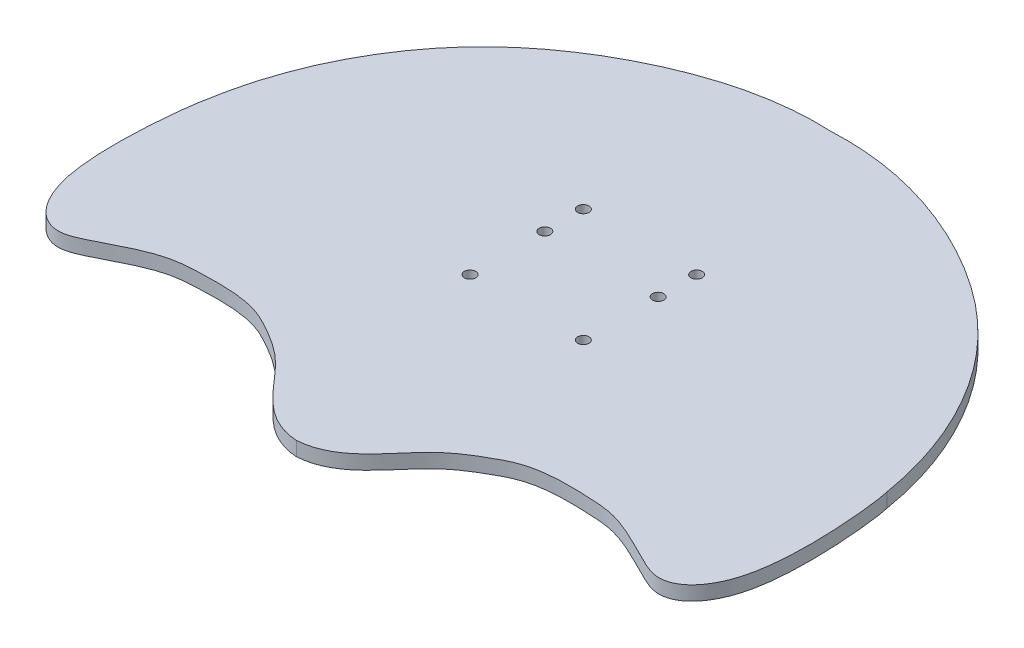
ISO-10303-21;
HEADER;
FILE_DESCRIPTION(('STEP AP214'),'2;1');
FILE_NAME('part.step','',(''),(''),'','','');
FILE_SCHEMA(('AUTOMOTIVE_DESIGN { 1 0 10303 214 1 1 1 1 }'));
ENDSEC;
DATA;
#1=APPLICATION_CONTEXT('core data for automotive mechanical design processes');
#2=APPLICATION_PROTOCOL_DEFINITION('international standard','automotive_design',2000,#1);
#3=PRODUCT_CONTEXT('',#1,'mechanical');
#4=PRODUCT('Part','Part','',(#3));
#5=PRODUCT_RELATED_PRODUCT_CATEGORY('part','',(#4));
#6=PRODUCT_DEFINITION_FORMATION('','',#4);
#7=PRODUCT_DEFINITION_CONTEXT('part definition',#1,'design');
#8=PRODUCT_DEFINITION('design','',#6,#7);
#9=PRODUCT_DEFINITION_SHAPE('','',#8);
#10=(LENGTH_UNIT() NAMED_UNIT(*) SI_UNIT(.MILLI.,.METRE.));
#11=(NAMED_UNIT(*) PLANE_ANGLE_UNIT() SI_UNIT($,.RADIAN.));
#12=(NAMED_UNIT(*) SI_UNIT($,.STERADIAN.) SOLID_ANGLE_UNIT());
#13=UNCERTAINTY_MEASURE_WITH_UNIT(LENGTH_MEASURE(1.E-05),#10,'distance_accuracy_value','');
#14=(GEOMETRIC_REPRESENTATION_CONTEXT(3) GLOBAL_UNCERTAINTY_ASSIGNED_CONTEXT((#13)) GLOBAL_UNIT_ASSIGNED_CONTEXT((#10,
#11,#12)) REPRESENTATION_CONTEXT('',''));
#15=CARTESIAN_POINT('',(0.,0.,0.));
#16=DIRECTION('',(0.,0.,1.));
#17=DIRECTION('',(1.,0.,0.));
#18=AXIS2_PLACEMENT_3D('',#15,#16,#17);
#19=CARTESIAN_POINT('',(-190.5,7.9502,0.));
#20=CARTESIAN_POINT('',(-192.064011792662,7.9502,4.96350192621509));
#21=CARTESIAN_POINT('',(-201.967167765924,7.9502,83.3146183109833));
#22=CARTESIAN_POINT('',(-174.696602041029,7.9502,109.289958804391));
#23=CARTESIAN_POINT('',(-151.630121659032,7.9502,100.567984898405));
#24=CARTESIAN_POINT('',(-131.410771519055,7.9502,87.7197839609674));
#25=CARTESIAN_POINT('',(-96.8435676275136,7.9502,85.3754033772216));
#26=CARTESIAN_POINT('',(-78.6925101438482,7.9502,86.2588274201763));
#27=CARTESIAN_POINT('',(-58.8335330715194,7.9502,96.8793824699203));
#28=CARTESIAN_POINT('',(-37.3059346099107,7.9502,109.935798161985));
#29=CARTESIAN_POINT('',(-21.3496139460233,7.9502,139.114767456721));
#30=CARTESIAN_POINT('',(1.40754784340045E-13,7.9502,140.530090072389));
#31=B_SPLINE_CURVE_WITH_KNOTS('',3,(#19,#20,#21,#22,#23,#24,#25,#26,#27,#28,#29,#30),
.UNSPECIFIED.,.F.,.F.,(4,1,1,1,1,1,1,1,1,4),(0.,0.166997051795611,0.292320514089622,
0.319633117373991,0.426735310498713,0.458914050276757,0.609241775376387,0.641909703937047,
0.766802370245909,1.),.UNSPECIFIED.);
#32=DIRECTION('',(0.,-1.,0.));
#33=VECTOR('',#32,1.);
#34=SURFACE_OF_LINEAR_EXTRUSION('',#31,#33);
#35=CARTESIAN_POINT('',(-190.5,0.,0.));
#36=CARTESIAN_POINT('',(-192.064011792662,0.,4.96350192621509));
#37=CARTESIAN_POINT('',(-201.967167765924,0.,83.3146183109833));
#38=CARTESIAN_POINT('',(-174.696602041029,0.,109.289958804391));
#39=CARTESIAN_POINT('',(-151.630121659032,0.,100.567984898405));
#40=CARTESIAN_POINT('',(-131.410771519055,0.,87.7197839609674));
#41=CARTESIAN_POINT('',(-96.8435676275136,0.,85.3754033772216));
#42=CARTESIAN_POINT('',(-78.6925101438482,0.,86.2588274201763));
#43=CARTESIAN_POINT('',(-58.8335330715194,0.,96.8793824699203));
#44=CARTESIAN_POINT('',(-37.3059346099107,0.,109.935798161985));
#45=CARTESIAN_POINT('',(-21.3496139460233,0.,139.114767456721));
#46=CARTESIAN_POINT('',(1.40754784340045E-13,0.,140.530090072389));
#47=B_SPLINE_CURVE_WITH_KNOTS('',3,(#35,#36,#37,#38,#39,#40,#41,#42,#43,#44,#45,#46),
.UNSPECIFIED.,.F.,.F.,(4,1,1,1,1,1,1,1,1,4),(0.,0.166997051795611,0.292320514089622,
0.319633117373991,0.426735310498713,0.458914050276757,0.609241775376387,0.641909703937047,
0.766802370245909,1.),.UNSPECIFIED.);
#48=CARTESIAN_POINT('',(-190.5,0.,0.));
#49=VERTEX_POINT('',#48);
#50=CARTESIAN_POINT('',(-1.06334839341837E-13,0.,140.530090072389));
#51=VERTEX_POINT('',#50);
#52=EDGE_CURVE('E141',#49,#51,#47,.T.);
#53=ORIENTED_EDGE('',*,*,#52,.T.);
#54=DIRECTION('',(0.,-1.,0.));
#55=VECTOR('',#54,1.);
#56=CARTESIAN_POINT('',(-1.06334839341837E-13,7.9502,140.530090072389));
#57=LINE('',#56,#55);
#58=CARTESIAN_POINT('',(-1.06334839341837E-13,7.9502,140.530090072389));
#59=VERTEX_POINT('',#58);
#60=EDGE_CURVE('E11',#59,#51,#57,.T.);
#61=ORIENTED_EDGE('',*,*,#60,.F.);
#62=CARTESIAN_POINT('',(-190.5,7.9502,0.));
#63=VERTEX_POINT('',#62);
#64=EDGE_CURVE('E99',#63,#59,#31,.T.);
#65=ORIENTED_EDGE('',*,*,#64,.F.);
#66=DIRECTION('',(0.,-1.,0.));
#67=VECTOR('',#66,1.);
#68=CARTESIAN_POINT('',(-190.5,7.9502,0.));
#69=LINE('',#68,#67);
#70=EDGE_CURVE('E112',#63,#49,#69,.T.);
#71=ORIENTED_EDGE('',*,*,#70,.T.);
#72=EDGE_LOOP('',(#53,#61,#65,#71));
#73=FACE_BOUND('',#72,.T.);
#74=ADVANCED_FACE('F46',(#73),#34,.F.);
#75=CARTESIAN_POINT('',(-1.06334839341837E-13,7.9502,140.530090072389));
#76=CARTESIAN_POINT('',(21.3496139460233,7.9502,139.114767456721));
#77=CARTESIAN_POINT('',(37.3059346099107,7.9502,109.935798161984));
#78=CARTESIAN_POINT('',(58.8335330715195,7.9502,96.8793824699203));
#79=CARTESIAN_POINT('',(78.6925101438482,7.9502,86.2588274201763));
#80=CARTESIAN_POINT('',(96.8435676275136,7.9502,85.3754033772216));
#81=CARTESIAN_POINT('',(131.410771519055,7.9502,87.7197839609674));
#82=CARTESIAN_POINT('',(151.630121659032,7.9502,100.567984898405));
#83=CARTESIAN_POINT('',(174.696602041029,7.9502,109.289958804391));
#84=CARTESIAN_POINT('',(201.967167765924,7.9502,83.3146183109832));
#85=CARTESIAN_POINT('',(192.064011792662,7.9502,4.96350192621503));
#86=CARTESIAN_POINT('',(190.5,7.9502,0.));
#87=B_SPLINE_CURVE_WITH_KNOTS('',3,(#75,#76,#77,#78,#79,#80,#81,#82,#83,#84,#85,#86),
.UNSPECIFIED.,.F.,.F.,(4,1,1,1,1,1,1,1,1,4),(0.,0.233197629754091,0.358090296062953,
0.390758224623613,0.541085949723243,0.573264689501287,0.680366882626009,0.707679485910378,
0.833002948204389,1.),.UNSPECIFIED.);
#88=DIRECTION('',(0.,-1.,0.));
#89=VECTOR('',#88,1.);
#90=SURFACE_OF_LINEAR_EXTRUSION('',#87,#89);
#91=CARTESIAN_POINT('',(-1.06334839341837E-13,0.,140.530090072389));
#92=CARTESIAN_POINT('',(21.3496139460233,0.,139.114767456721));
#93=CARTESIAN_POINT('',(37.3059346099107,0.,109.935798161984));
#94=CARTESIAN_POINT('',(58.8335330715195,0.,96.8793824699203));
#95=CARTESIAN_POINT('',(78.6925101438482,0.,86.2588274201763));
#96=CARTESIAN_POINT('',(96.8435676275136,0.,85.3754033772216));
#97=CARTESIAN_POINT('',(131.410771519055,0.,87.7197839609674));
#98=CARTESIAN_POINT('',(151.630121659032,0.,100.567984898405));
#99=CARTESIAN_POINT('',(174.696602041029,0.,109.289958804391));
#100=CARTESIAN_POINT('',(201.967167765924,0.,83.3146183109832));
#101=CARTESIAN_POINT('',(192.064011792662,0.,4.96350192621503));
#102=CARTESIAN_POINT('',(190.5,0.,0.));
#103=B_SPLINE_CURVE_WITH_KNOTS('',3,(#91,#92,#93,#94,#95,#96,#97,#98,#99,#100,#101,#102),
.UNSPECIFIED.,.F.,.F.,(4,1,1,1,1,1,1,1,1,4),(0.,0.233197629754091,0.358090296062953,
0.390758224623613,0.541085949723243,0.573264689501287,0.680366882626009,0.707679485910378,
0.833002948204389,1.),.UNSPECIFIED.);
#104=CARTESIAN_POINT('',(190.5,0.,0.));
#105=VERTEX_POINT('',#104);
#106=EDGE_CURVE('E104',#51,#105,#103,.T.);
#107=ORIENTED_EDGE('',*,*,#106,.T.);
#108=DIRECTION('',(0.,-1.,0.));
#109=VECTOR('',#108,1.);
#110=CARTESIAN_POINT('',(190.5,7.9502,0.));
#111=LINE('',#110,#109);
#112=CARTESIAN_POINT('',(190.5,7.9502,0.));
#113=VERTEX_POINT('',#112);
#114=EDGE_CURVE('E56',#113,#105,#111,.T.);
#115=ORIENTED_EDGE('',*,*,#114,.F.);
#116=EDGE_CURVE('E94',#59,#113,#87,.T.);
#117=ORIENTED_EDGE('',*,*,#116,.F.);
#118=ORIENTED_EDGE('',*,*,#60,.T.);
#119=EDGE_LOOP('',(#107,#115,#117,#118));
#120=FACE_BOUND('',#119,.T.);
#121=ADVANCED_FACE('F103',(#120),#90,.F.);
#122=CARTESIAN_POINT('',(190.5,7.9502,0.));
#123=CARTESIAN_POINT('',(184.392726562295,7.9502,-37.5370382365467));
#124=CARTESIAN_POINT('',(157.261289846749,7.9502,-93.9640934852783));
#125=CARTESIAN_POINT('',(82.3874782016624,7.9502,-146.622658841393));
#126=CARTESIAN_POINT('',(31.3113741429568,7.9502,-160.799884185231));
#127=CARTESIAN_POINT('',(0.,7.9502,-159.189909927611));
#128=B_SPLINE_CURVE_WITH_KNOTS('',3,(#122,#123,#124,#125,#126,#127),.UNSPECIFIED.,.F.,.F.,(4,1,
1,4),(0.,0.424401365551712,0.65636958095173,1.),.UNSPECIFIED.);
#129=DIRECTION('',(0.,-1.,0.));
#130=VECTOR('',#129,1.);
#131=SURFACE_OF_LINEAR_EXTRUSION('',#128,#130);
#132=CARTESIAN_POINT('',(190.5,0.,0.));
#133=CARTESIAN_POINT('',(184.392726562295,0.,-37.5370382365467));
#134=CARTESIAN_POINT('',(157.261289846749,0.,-93.9640934852783));
#135=CARTESIAN_POINT('',(82.3874782016624,0.,-146.622658841393));
#136=CARTESIAN_POINT('',(31.3113741429568,0.,-160.799884185231));
#137=CARTESIAN_POINT('',(0.,0.,-159.189909927611));
#138=B_SPLINE_CURVE_WITH_KNOTS('',3,(#132,#133,#134,#135,#136,#137),.UNSPECIFIED.,.F.,.F.,(4,1,
1,4),(0.,0.424401365551712,0.65636958095173,1.),.UNSPECIFIED.);
#139=CARTESIAN_POINT('',(0.,0.,-159.189909927611));
#140=VERTEX_POINT('',#139);
#141=EDGE_CURVE('E81',#105,#140,#138,.T.);
#142=ORIENTED_EDGE('',*,*,#141,.T.);
#143=DIRECTION('',(0.,-1.,0.));
#144=VECTOR('',#143,1.);
#145=CARTESIAN_POINT('',(0.,7.9502,-159.189909927611));
#146=LINE('',#145,#144);
#147=CARTESIAN_POINT('',(0.,7.9502,-159.189909927611));
#148=VERTEX_POINT('',#147);
#149=EDGE_CURVE('E106',#148,#140,#146,.T.);
#150=ORIENTED_EDGE('',*,*,#149,.F.);
#151=EDGE_CURVE('E97',#113,#148,#128,.T.);
#152=ORIENTED_EDGE('',*,*,#151,.F.);
#153=ORIENTED_EDGE('',*,*,#114,.T.);
#154=EDGE_LOOP('',(#142,#150,#152,#153));
#155=FACE_BOUND('',#154,.T.);
#156=ADVANCED_FACE('F107',(#155),#131,.F.);
#157=CARTESIAN_POINT('',(0.,7.9502,-159.189909927611));
#158=CARTESIAN_POINT('',(-31.3113741429568,7.9502,-160.799884185231));
#159=CARTESIAN_POINT('',(-82.3874782016624,7.9502,-146.622658841393));
#160=CARTESIAN_POINT('',(-157.261289846749,7.9502,-93.9640934852783));
#161=CARTESIAN_POINT('',(-184.392726562295,7.9502,-37.5370382365467));
#162=CARTESIAN_POINT('',(-190.5,7.9502,0.));
#163=B_SPLINE_CURVE_WITH_KNOTS('',3,(#157,#158,#159,#160,#161,#162),.UNSPECIFIED.,.F.,.F.,(4,1,
1,4),(0.,0.34363041904827,0.575598634448288,1.),.UNSPECIFIED.);
#164=DIRECTION('',(0.,-1.,0.));
#165=VECTOR('',#164,1.);
#166=SURFACE_OF_LINEAR_EXTRUSION('',#163,#165);
#167=CARTESIAN_POINT('',(0.,0.,-159.189909927611));
#168=CARTESIAN_POINT('',(-31.3113741429568,0.,-160.799884185231));
#169=CARTESIAN_POINT('',(-82.3874782016624,0.,-146.622658841393));
#170=CARTESIAN_POINT('',(-157.261289846749,0.,-93.9640934852783));
#171=CARTESIAN_POINT('',(-184.392726562295,0.,-37.5370382365467));
#172=CARTESIAN_POINT('',(-190.5,0.,0.));
#173=B_SPLINE_CURVE_WITH_KNOTS('',3,(#167,#168,#169,#170,#171,#172),.UNSPECIFIED.,.F.,.F.,(4,1,
1,4),(0.,0.34363041904827,0.575598634448288,1.),.UNSPECIFIED.);
#174=EDGE_CURVE('E87',#140,#49,#173,.T.);
#175=ORIENTED_EDGE('',*,*,#174,.T.);
#176=ORIENTED_EDGE('',*,*,#70,.F.);
#177=EDGE_CURVE('E64',#148,#63,#163,.T.);
#178=ORIENTED_EDGE('',*,*,#177,.F.);
#179=ORIENTED_EDGE('',*,*,#149,.T.);
#180=EDGE_LOOP('',(#175,#176,#178,#179));
#181=FACE_BOUND('',#180,.T.);
#182=ADVANCED_FACE('F130',(#181),#166,.F.);
#183=CARTESIAN_POINT('',(-98.1259130559372,7.9502,86.0527308590208));
#184=DIRECTION('',(0.,-1.,0.));
#185=DIRECTION('',(0.,0.,-1.));
#186=AXIS2_PLACEMENT_3D('',#183,#184,#185);
#187=PLANE('',#186);
#188=CARTESIAN_POINT('',(31.75,7.9502,-52.07));
#189=DIRECTION('',(0.,-1.,0.));
#190=DIRECTION('',(0.,0.,-1.));
#191=AXIS2_PLACEMENT_3D('',#188,#189,#190);
#192=CIRCLE('',#191,3.175);
#193=CARTESIAN_POINT('',(31.75,7.9502,-55.245));
#194=VERTEX_POINT('',#193);
#195=EDGE_CURVE('E220',#194,#194,#192,.T.);
#196=ORIENTED_EDGE('',*,*,#195,.T.);
#197=EDGE_LOOP('',(#196));
#198=FACE_BOUND('',#197,.T.);
#199=CARTESIAN_POINT('',(-31.75,7.9502,-52.07));
#200=DIRECTION('',(0.,-1.,0.));
#201=DIRECTION('',(0.,0.,-1.));
#202=AXIS2_PLACEMENT_3D('',#199,#200,#201);
#203=CIRCLE('',#202,3.175);
#204=CARTESIAN_POINT('',(-31.75,7.9502,-55.245));
#205=VERTEX_POINT('',#204);
#206=EDGE_CURVE('E233',#205,#205,#203,.T.);
#207=ORIENTED_EDGE('',*,*,#206,.T.);
#208=EDGE_LOOP('',(#207));
#209=FACE_BOUND('',#208,.T.);
#210=CARTESIAN_POINT('',(-31.75,7.9502,11.43));
#211=DIRECTION('',(0.,-1.,0.));
#212=DIRECTION('',(0.,0.,-1.));
#213=AXIS2_PLACEMENT_3D('',#210,#211,#212);
#214=CIRCLE('',#213,3.175);
#215=CARTESIAN_POINT('',(-31.75,7.9502,8.255));
#216=VERTEX_POINT('',#215);
#217=EDGE_CURVE('E241',#216,#216,#214,.T.);
#218=ORIENTED_EDGE('',*,*,#217,.T.);
#219=EDGE_LOOP('',(#218));
#220=FACE_BOUND('',#219,.T.);
#221=CARTESIAN_POINT('',(31.75,7.9502,11.43));
#222=DIRECTION('',(0.,-1.,0.));
#223=DIRECTION('',(0.,0.,-1.));
#224=AXIS2_PLACEMENT_3D('',#221,#222,#223);
#225=CIRCLE('',#224,3.175);
#226=CARTESIAN_POINT('',(31.75,7.9502,8.25500000000001));
#227=VERTEX_POINT('',#226);
#228=EDGE_CURVE('E249',#227,#227,#225,.T.);
#229=ORIENTED_EDGE('',*,*,#228,.T.);
#230=EDGE_LOOP('',(#229));
#231=FACE_BOUND('',#230,.T.);
#232=CARTESIAN_POINT('',(31.75,7.9502,-30.48));
#233=DIRECTION('',(0.,-1.,0.));
#234=DIRECTION('',(0.,0.,-1.));
#235=AXIS2_PLACEMENT_3D('',#232,#233,#234);
#236=CIRCLE('',#235,3.175);
#237=CARTESIAN_POINT('',(31.75,7.9502,-33.655));
#238=VERTEX_POINT('',#237);
#239=EDGE_CURVE('E257',#238,#238,#236,.T.);
#240=ORIENTED_EDGE('',*,*,#239,.T.);
#241=EDGE_LOOP('',(#240));
#242=FACE_BOUND('',#241,.T.);
#243=CARTESIAN_POINT('',(-31.75,7.9502,-30.48));
#244=DIRECTION('',(0.,-1.,0.));
#245=DIRECTION('',(0.,0.,-1.));
#246=AXIS2_PLACEMENT_3D('',#243,#244,#245);
#247=CIRCLE('',#246,3.175);
#248=CARTESIAN_POINT('',(-31.75,7.9502,-33.655));
#249=VERTEX_POINT('',#248);
#250=EDGE_CURVE('E144',#249,#249,#247,.T.);
#251=ORIENTED_EDGE('',*,*,#250,.T.);
#252=EDGE_LOOP('',(#251));
#253=FACE_BOUND('',#252,.T.);
#254=ORIENTED_EDGE('',*,*,#64,.T.);
#255=ORIENTED_EDGE('',*,*,#116,.T.);
#256=ORIENTED_EDGE('',*,*,#151,.T.);
#257=ORIENTED_EDGE('',*,*,#177,.T.);
#258=EDGE_LOOP('',(#254,#255,#256,#257));
#259=FACE_BOUND('',#258,.T.);
#260=ADVANCED_FACE('F95',(#198,#209,#220,#231,#242,#253,#259),#187,.F.);
#261=CARTESIAN_POINT('',(-98.1259130559372,0.,86.0527308590208));
#262=DIRECTION('',(0.,-1.,0.));
#263=DIRECTION('',(0.,0.,-1.));
#264=AXIS2_PLACEMENT_3D('',#261,#262,#263);
#265=PLANE('',#264);
#266=CARTESIAN_POINT('',(31.75,0.,-52.07));
#267=DIRECTION('',(0.,-1.,0.));
#268=DIRECTION('',(0.,0.,-1.));
#269=AXIS2_PLACEMENT_3D('',#266,#267,#268);
#270=CIRCLE('',#269,3.175);
#271=CARTESIAN_POINT('',(31.75,0.,-55.245));
#272=VERTEX_POINT('',#271);
#273=EDGE_CURVE('E222',#272,#272,#270,.T.);
#274=ORIENTED_EDGE('',*,*,#273,.F.);
#275=EDGE_LOOP('',(#274));
#276=FACE_BOUND('',#275,.T.);
#277=CARTESIAN_POINT('',(-31.75,0.,-52.07));
#278=DIRECTION('',(0.,-1.,0.));
#279=DIRECTION('',(0.,0.,-1.));
#280=AXIS2_PLACEMENT_3D('',#277,#278,#279);
#281=CIRCLE('',#280,3.175);
#282=CARTESIAN_POINT('',(-31.75,0.,-55.245));
#283=VERTEX_POINT('',#282);
#284=EDGE_CURVE('E227',#283,#283,#281,.T.);
#285=ORIENTED_EDGE('',*,*,#284,.F.);
#286=EDGE_LOOP('',(#285));
#287=FACE_BOUND('',#286,.T.);
#288=CARTESIAN_POINT('',(-31.75,0.,11.43));
#289=DIRECTION('',(0.,-1.,0.));
#290=DIRECTION('',(0.,0.,-1.));
#291=AXIS2_PLACEMENT_3D('',#288,#289,#290);
#292=CIRCLE('',#291,3.175);
#293=CARTESIAN_POINT('',(-31.75,0.,8.255));
#294=VERTEX_POINT('',#293);
#295=EDGE_CURVE('E237',#294,#294,#292,.T.);
#296=ORIENTED_EDGE('',*,*,#295,.F.);
#297=EDGE_LOOP('',(#296));
#298=FACE_BOUND('',#297,.T.);
#299=CARTESIAN_POINT('',(31.75,0.,11.43));
#300=DIRECTION('',(0.,-1.,0.));
#301=DIRECTION('',(0.,0.,-1.));
#302=AXIS2_PLACEMENT_3D('',#299,#300,#301);
#303=CIRCLE('',#302,3.175);
#304=CARTESIAN_POINT('',(31.75,0.,8.25500000000001));
#305=VERTEX_POINT('',#304);
#306=EDGE_CURVE('E245',#305,#305,#303,.T.);
#307=ORIENTED_EDGE('',*,*,#306,.F.);
#308=EDGE_LOOP('',(#307));
#309=FACE_BOUND('',#308,.T.);
#310=CARTESIAN_POINT('',(31.75,0.,-30.48));
#311=DIRECTION('',(0.,-1.,0.));
#312=DIRECTION('',(0.,0.,-1.));
#313=AXIS2_PLACEMENT_3D('',#310,#311,#312);
#314=CIRCLE('',#313,3.175);
#315=CARTESIAN_POINT('',(31.75,0.,-33.655));
#316=VERTEX_POINT('',#315);
#317=EDGE_CURVE('E253',#316,#316,#314,.T.);
#318=ORIENTED_EDGE('',*,*,#317,.F.);
#319=EDGE_LOOP('',(#318));
#320=FACE_BOUND('',#319,.T.);
#321=CARTESIAN_POINT('',(-31.75,0.,-30.48));
#322=DIRECTION('',(0.,-1.,0.));
#323=DIRECTION('',(0.,0.,-1.));
#324=AXIS2_PLACEMENT_3D('',#321,#322,#323);
#325=CIRCLE('',#324,3.175);
#326=CARTESIAN_POINT('',(-31.75,0.,-33.655));
#327=VERTEX_POINT('',#326);
#328=EDGE_CURVE('E150',#327,#327,#325,.T.);
#329=ORIENTED_EDGE('',*,*,#328,.F.);
#330=EDGE_LOOP('',(#329));
#331=FACE_BOUND('',#330,.T.);
#332=ORIENTED_EDGE('',*,*,#52,.F.);
#333=ORIENTED_EDGE('',*,*,#174,.F.);
#334=ORIENTED_EDGE('',*,*,#141,.F.);
#335=ORIENTED_EDGE('',*,*,#106,.F.);
#336=EDGE_LOOP('',(#332,#333,#334,#335));
#337=FACE_BOUND('',#336,.T.);
#338=ADVANCED_FACE('F181',(#276,#287,#298,#309,#320,#331,#337),#265,.T.);
#339=CARTESIAN_POINT('',(-31.75,0.,-30.48));
#340=DIRECTION('',(0.,-1.,0.));
#341=DIRECTION('',(0.,0.,-1.));
#342=AXIS2_PLACEMENT_3D('',#339,#340,#341);
#343=CYLINDRICAL_SURFACE('',#342,3.175);
#344=ORIENTED_EDGE('',*,*,#250,.F.);
#345=EDGE_LOOP('',(#344));
#346=FACE_BOUND('',#345,.T.);
#347=ORIENTED_EDGE('',*,*,#328,.T.);
#348=EDGE_LOOP('',(#347));
#349=FACE_BOUND('',#348,.T.);
#350=ADVANCED_FACE('F183',(#346,#349),#343,.F.);
#351=CARTESIAN_POINT('',(31.75,0.,-30.48));
#352=DIRECTION('',(0.,-1.,0.));
#353=DIRECTION('',(0.,0.,-1.));
#354=AXIS2_PLACEMENT_3D('',#351,#352,#353);
#355=CYLINDRICAL_SURFACE('',#354,3.175);
#356=ORIENTED_EDGE('',*,*,#239,.F.);
#357=EDGE_LOOP('',(#356));
#358=FACE_BOUND('',#357,.T.);
#359=ORIENTED_EDGE('',*,*,#317,.T.);
#360=EDGE_LOOP('',(#359));
#361=FACE_BOUND('',#360,.T.);
#362=ADVANCED_FACE('F189',(#358,#361),#355,.F.);
#363=CARTESIAN_POINT('',(31.75,0.,11.43));
#364=DIRECTION('',(0.,-1.,0.));
#365=DIRECTION('',(0.,0.,-1.));
#366=AXIS2_PLACEMENT_3D('',#363,#364,#365);
#367=CYLINDRICAL_SURFACE('',#366,3.175);
#368=ORIENTED_EDGE('',*,*,#228,.F.);
#369=EDGE_LOOP('',(#368));
#370=FACE_BOUND('',#369,.T.);
#371=ORIENTED_EDGE('',*,*,#306,.T.);
#372=EDGE_LOOP('',(#371));
#373=FACE_BOUND('',#372,.T.);
#374=ADVANCED_FACE('F199',(#370,#373),#367,.F.);
#375=CARTESIAN_POINT('',(-31.75,0.,11.43));
#376=DIRECTION('',(0.,-1.,0.));
#377=DIRECTION('',(0.,0.,-1.));
#378=AXIS2_PLACEMENT_3D('',#375,#376,#377);
#379=CYLINDRICAL_SURFACE('',#378,3.175);
#380=ORIENTED_EDGE('',*,*,#217,.F.);
#381=EDGE_LOOP('',(#380));
#382=FACE_BOUND('',#381,.T.);
#383=ORIENTED_EDGE('',*,*,#295,.T.);
#384=EDGE_LOOP('',(#383));
#385=FACE_BOUND('',#384,.T.);
#386=ADVANCED_FACE('F203',(#382,#385),#379,.F.);
#387=CARTESIAN_POINT('',(-31.75,0.,-52.07));
#388=DIRECTION('',(0.,-1.,0.));
#389=DIRECTION('',(0.,0.,-1.));
#390=AXIS2_PLACEMENT_3D('',#387,#388,#389);
#391=CYLINDRICAL_SURFACE('',#390,3.175);
#392=ORIENTED_EDGE('',*,*,#206,.F.);
#393=EDGE_LOOP('',(#392));
#394=FACE_BOUND('',#393,.T.);
#395=ORIENTED_EDGE('',*,*,#284,.T.);
#396=EDGE_LOOP('',(#395));
#397=FACE_BOUND('',#396,.T.);
#398=ADVANCED_FACE('F207',(#394,#397),#391,.F.);
#399=CARTESIAN_POINT('',(31.75,0.,-52.07));
#400=DIRECTION('',(0.,-1.,0.));
#401=DIRECTION('',(0.,0.,-1.));
#402=AXIS2_PLACEMENT_3D('',#399,#400,#401);
#403=CYLINDRICAL_SURFACE('',#402,3.175);
#404=ORIENTED_EDGE('',*,*,#195,.F.);
#405=EDGE_LOOP('',(#404));
#406=FACE_BOUND('',#405,.T.);
#407=ORIENTED_EDGE('',*,*,#273,.T.);
#408=EDGE_LOOP('',(#407));
#409=FACE_BOUND('',#408,.T.);
#410=ADVANCED_FACE('F211',(#406,#409),#403,.F.);
#411=CLOSED_SHELL('',(#74,#121,#156,#182,#260,#338,#350,#362,#374,#386,#398,#410));
#412=MANIFOLD_SOLID_BREP('B2',#411);
#413=ADVANCED_BREP_SHAPE_REPRESENTATION('',(#18,#412),#14);
#414=SHAPE_DEFINITION_REPRESENTATION(#9,#413);
ENDSEC;
END-ISO-10303-21;
